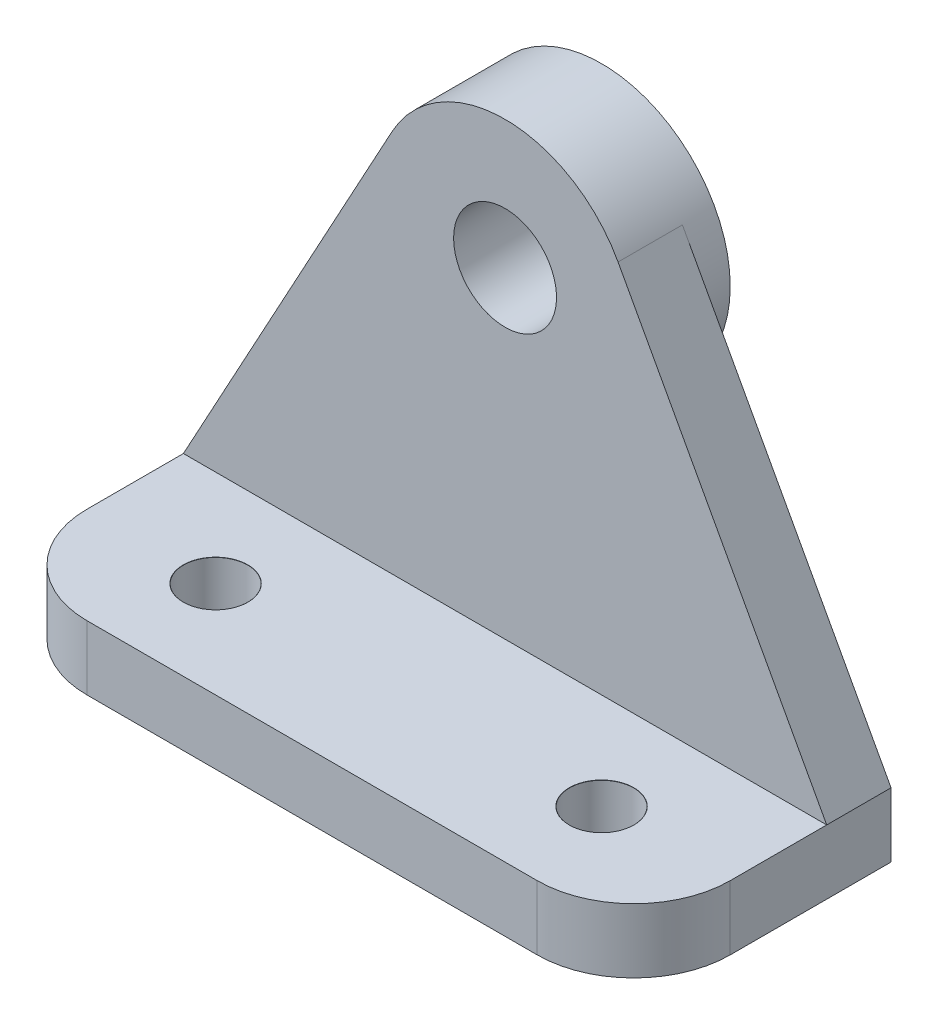
ISO-10303-21;
HEADER;
FILE_DESCRIPTION(('STEP AP214'),'2;1');
FILE_NAME('part.step','',(''),(''),'','','');
FILE_SCHEMA(('AUTOMOTIVE_DESIGN { 1 0 10303 214 1 1 1 1 }'));
ENDSEC;
DATA;
#1=APPLICATION_CONTEXT('core data for automotive mechanical design processes');
#2=APPLICATION_PROTOCOL_DEFINITION('international standard','automotive_design',2000,#1);
#3=PRODUCT_CONTEXT('',#1,'mechanical');
#4=PRODUCT('Part','Part','',(#3));
#5=PRODUCT_RELATED_PRODUCT_CATEGORY('part','',(#4));
#6=PRODUCT_DEFINITION_FORMATION('','',#4);
#7=PRODUCT_DEFINITION_CONTEXT('part definition',#1,'design');
#8=PRODUCT_DEFINITION('design','',#6,#7);
#9=PRODUCT_DEFINITION_SHAPE('','',#8);
#10=(LENGTH_UNIT() NAMED_UNIT(*) SI_UNIT(.MILLI.,.METRE.));
#11=(NAMED_UNIT(*) PLANE_ANGLE_UNIT() SI_UNIT($,.RADIAN.));
#12=(NAMED_UNIT(*) SI_UNIT($,.STERADIAN.) SOLID_ANGLE_UNIT());
#13=UNCERTAINTY_MEASURE_WITH_UNIT(LENGTH_MEASURE(1.E-05),#10,'distance_accuracy_value','');
#14=(GEOMETRIC_REPRESENTATION_CONTEXT(3) GLOBAL_UNCERTAINTY_ASSIGNED_CONTEXT((#13)) GLOBAL_UNIT_ASSIGNED_CONTEXT((#10,
#11,#12)) REPRESENTATION_CONTEXT('',''));
#15=CARTESIAN_POINT('',(0.,0.,0.));
#16=DIRECTION('',(0.,0.,1.));
#17=DIRECTION('',(1.,0.,0.));
#18=AXIS2_PLACEMENT_3D('',#15,#16,#17);
#19=CARTESIAN_POINT('',(-50.,10.,0.));
#20=DIRECTION('',(1.,0.,0.));
#21=DIRECTION('',(0.,0.,-1.));
#22=AXIS2_PLACEMENT_3D('',#19,#20,#21);
#23=PLANE('',#22);
#24=DIRECTION('',(0.,0.,1.));
#25=VECTOR('',#24,1.);
#26=CARTESIAN_POINT('',(-50.,0.,0.));
#27=LINE('',#26,#25);
#28=CARTESIAN_POINT('',(-50.,0.,-40.));
#29=VERTEX_POINT('',#28);
#30=CARTESIAN_POINT('',(-50.,0.,-15.));
#31=VERTEX_POINT('',#30);
#32=EDGE_CURVE('E133',#29,#31,#27,.T.);
#33=ORIENTED_EDGE('',*,*,#32,.T.);
#34=DIRECTION('',(0.,-1.,0.));
#35=VECTOR('',#34,1.);
#36=CARTESIAN_POINT('',(-50.,10.,-15.));
#37=LINE('',#36,#35);
#38=CARTESIAN_POINT('',(-50.,10.,-15.));
#39=VERTEX_POINT('',#38);
#40=EDGE_CURVE('E11',#31,#39,#37,.F.);
#41=ORIENTED_EDGE('',*,*,#40,.T.);
#42=DIRECTION('',(0.,0.,1.));
#43=VECTOR('',#42,1.);
#44=CARTESIAN_POINT('',(-50.,10.,0.));
#45=LINE('',#44,#43);
#46=CARTESIAN_POINT('',(-50.,10.,-30.));
#47=VERTEX_POINT('',#46);
#48=EDGE_CURVE('E153',#47,#39,#45,.T.);
#49=ORIENTED_EDGE('',*,*,#48,.F.);
#50=CARTESIAN_POINT('',(-50.,10.,-40.));
#51=VERTEX_POINT('',#50);
#52=EDGE_CURVE('E150',#51,#47,#45,.T.);
#53=ORIENTED_EDGE('',*,*,#52,.F.);
#54=DIRECTION('',(0.,-1.,0.));
#55=VECTOR('',#54,1.);
#56=CARTESIAN_POINT('',(-50.,10.,-40.));
#57=LINE('',#56,#55);
#58=EDGE_CURVE('E138',#51,#29,#57,.T.);
#59=ORIENTED_EDGE('',*,*,#58,.T.);
#60=EDGE_LOOP('',(#33,#41,#49,#53,#59));
#61=FACE_BOUND('',#60,.T.);
#62=ADVANCED_FACE('F39',(#61),#23,.F.);
#63=CARTESIAN_POINT('',(50.,10.,0.));
#64=DIRECTION('',(0.,0.,-1.));
#65=DIRECTION('',(-1.,0.,0.));
#66=AXIS2_PLACEMENT_3D('',#63,#64,#65);
#67=PLANE('',#66);
#68=DIRECTION('',(1.,0.,0.));
#69=VECTOR('',#68,1.);
#70=CARTESIAN_POINT('',(50.,0.,0.));
#71=LINE('',#70,#69);
#72=CARTESIAN_POINT('',(-35.,0.,0.));
#73=VERTEX_POINT('',#72);
#74=CARTESIAN_POINT('',(35.,0.,0.));
#75=VERTEX_POINT('',#74);
#76=EDGE_CURVE('E158',#73,#75,#71,.T.);
#77=ORIENTED_EDGE('',*,*,#76,.T.);
#78=DIRECTION('',(0.,-1.,0.));
#79=VECTOR('',#78,1.);
#80=CARTESIAN_POINT('',(35.,10.,0.));
#81=LINE('',#80,#79);
#82=CARTESIAN_POINT('',(35.,10.,0.));
#83=VERTEX_POINT('',#82);
#84=EDGE_CURVE('E60',#75,#83,#81,.F.);
#85=ORIENTED_EDGE('',*,*,#84,.T.);
#86=DIRECTION('',(1.,0.,0.));
#87=VECTOR('',#86,1.);
#88=CARTESIAN_POINT('',(50.,10.,0.));
#89=LINE('',#88,#87);
#90=CARTESIAN_POINT('',(-35.,10.,0.));
#91=VERTEX_POINT('',#90);
#92=EDGE_CURVE('E152',#91,#83,#89,.T.);
#93=ORIENTED_EDGE('',*,*,#92,.F.);
#94=DIRECTION('',(0.,-1.,0.));
#95=VECTOR('',#94,1.);
#96=CARTESIAN_POINT('',(-35.,10.,0.));
#97=LINE('',#96,#95);
#98=EDGE_CURVE('E175',#91,#73,#97,.T.);
#99=ORIENTED_EDGE('',*,*,#98,.T.);
#100=EDGE_LOOP('',(#77,#85,#93,#99));
#101=FACE_BOUND('',#100,.T.);
#102=ADVANCED_FACE('F198',(#101),#67,.F.);
#103=CARTESIAN_POINT('',(50.,10.,-40.));
#104=DIRECTION('',(-1.,0.,0.));
#105=DIRECTION('',(0.,0.,1.));
#106=AXIS2_PLACEMENT_3D('',#103,#104,#105);
#107=PLANE('',#106);
#108=DIRECTION('',(0.,0.,-1.));
#109=VECTOR('',#108,1.);
#110=CARTESIAN_POINT('',(50.,10.,-40.));
#111=LINE('',#110,#109);
#112=CARTESIAN_POINT('',(50.,10.,-15.));
#113=VERTEX_POINT('',#112);
#114=CARTESIAN_POINT('',(50.,10.,-30.));
#115=VERTEX_POINT('',#114);
#116=EDGE_CURVE('E155',#113,#115,#111,.T.);
#117=ORIENTED_EDGE('',*,*,#116,.F.);
#118=DIRECTION('',(0.,-1.,0.));
#119=VECTOR('',#118,1.);
#120=CARTESIAN_POINT('',(50.,10.,-15.));
#121=LINE('',#120,#119);
#122=CARTESIAN_POINT('',(50.,0.,-15.));
#123=VERTEX_POINT('',#122);
#124=EDGE_CURVE('E168',#113,#123,#121,.T.);
#125=ORIENTED_EDGE('',*,*,#124,.T.);
#126=DIRECTION('',(0.,0.,-1.));
#127=VECTOR('',#126,1.);
#128=CARTESIAN_POINT('',(50.,0.,-40.));
#129=LINE('',#128,#127);
#130=CARTESIAN_POINT('',(50.,0.,-40.));
#131=VERTEX_POINT('',#130);
#132=EDGE_CURVE('E160',#123,#131,#129,.T.);
#133=ORIENTED_EDGE('',*,*,#132,.T.);
#134=DIRECTION('',(0.,-1.,0.));
#135=VECTOR('',#134,1.);
#136=CARTESIAN_POINT('',(50.,10.,-40.));
#137=LINE('',#136,#135);
#138=CARTESIAN_POINT('',(50.,10.,-40.));
#139=VERTEX_POINT('',#138);
#140=EDGE_CURVE('E165',#139,#131,#137,.T.);
#141=ORIENTED_EDGE('',*,*,#140,.F.);
#142=DIRECTION('',(0.,0.,-1.));
#143=VECTOR('',#142,1.);
#144=CARTESIAN_POINT('',(50.,10.,-30.));
#145=LINE('',#144,#143);
#146=EDGE_CURVE('E134',#115,#139,#145,.T.);
#147=ORIENTED_EDGE('',*,*,#146,.F.);
#148=EDGE_LOOP('',(#117,#125,#133,#141,#147));
#149=FACE_BOUND('',#148,.T.);
#150=ADVANCED_FACE('F190',(#149),#107,.F.);
#151=CARTESIAN_POINT('',(-50.,10.,-40.));
#152=DIRECTION('',(0.,0.,1.));
#153=DIRECTION('',(1.,0.,0.));
#154=AXIS2_PLACEMENT_3D('',#151,#152,#153);
#155=PLANE('',#154);
#156=DIRECTION('',(0.478232998312527,0.878232998312527,0.));
#157=VECTOR('',#156,1.);
#158=CARTESIAN_POINT('',(-17.5646599662505,69.5646599662505,-40.));
#159=LINE('',#158,#157);
#160=CARTESIAN_POINT('',(-17.5646599662505,69.5646599662505,-40.));
#161=VERTEX_POINT('',#160);
#162=EDGE_CURVE('E130',#51,#161,#159,.T.);
#163=ORIENTED_EDGE('',*,*,#162,.T.);
#164=CARTESIAN_POINT('',(0.,60.,-40.));
#165=DIRECTION('',(0.,0.,1.));
#166=DIRECTION('',(1.,0.,0.));
#167=AXIS2_PLACEMENT_3D('',#164,#165,#166);
#168=CIRCLE('',#167,20.);
#169=CARTESIAN_POINT('',(17.5646599662505,69.5646599662505,-40.));
#170=VERTEX_POINT('',#169);
#171=EDGE_CURVE('E111',#161,#170,#168,.T.);
#172=ORIENTED_EDGE('',*,*,#171,.T.);
#173=DIRECTION('',(0.478232998312527,-0.878232998312527,0.));
#174=VECTOR('',#173,1.);
#175=CARTESIAN_POINT('',(17.5646599662505,69.5646599662505,-40.));
#176=LINE('',#175,#174);
#177=EDGE_CURVE('E141',#170,#139,#176,.T.);
#178=ORIENTED_EDGE('',*,*,#177,.T.);
#179=ORIENTED_EDGE('',*,*,#140,.T.);
#180=DIRECTION('',(-1.,0.,0.));
#181=VECTOR('',#180,1.);
#182=CARTESIAN_POINT('',(-50.,0.,-40.));
#183=LINE('',#182,#181);
#184=EDGE_CURVE('E162',#131,#29,#183,.T.);
#185=ORIENTED_EDGE('',*,*,#184,.T.);
#186=ORIENTED_EDGE('',*,*,#58,.F.);
#187=EDGE_LOOP('',(#163,#172,#178,#179,#185,#186));
#188=FACE_BOUND('',#187,.T.);
#189=ADVANCED_FACE('F136',(#188),#155,.F.);
#190=CARTESIAN_POINT('',(0.,10.,0.));
#191=DIRECTION('',(0.,-1.,0.));
#192=DIRECTION('',(0.,0.,-1.));
#193=AXIS2_PLACEMENT_3D('',#190,#191,#192);
#194=PLANE('',#193);
#195=CARTESIAN_POINT('',(-30.,10.,-15.));
#196=DIRECTION('',(0.,1.,0.));
#197=DIRECTION('',(0.,0.,1.));
#198=AXIS2_PLACEMENT_3D('',#195,#196,#197);
#199=CIRCLE('',#198,5.025);
#200=CARTESIAN_POINT('',(-30.,10.,-9.97499999999998));
#201=VERTEX_POINT('',#200);
#202=EDGE_CURVE('E232',#201,#201,#199,.T.);
#203=ORIENTED_EDGE('',*,*,#202,.F.);
#204=EDGE_LOOP('',(#203));
#205=FACE_BOUND('',#204,.T.);
#206=CARTESIAN_POINT('',(30.,10.,-15.));
#207=DIRECTION('',(0.,1.,0.));
#208=DIRECTION('',(0.,0.,1.));
#209=AXIS2_PLACEMENT_3D('',#206,#207,#208);
#210=CIRCLE('',#209,5.025);
#211=CARTESIAN_POINT('',(30.,10.,-9.975));
#212=VERTEX_POINT('',#211);
#213=EDGE_CURVE('E223',#212,#212,#210,.T.);
#214=ORIENTED_EDGE('',*,*,#213,.F.);
#215=EDGE_LOOP('',(#214));
#216=FACE_BOUND('',#215,.T.);
#217=ORIENTED_EDGE('',*,*,#92,.T.);
#218=CARTESIAN_POINT('',(35.,10.,-15.));
#219=DIRECTION('',(0.,-1.,0.));
#220=DIRECTION('',(0.,0.,-1.));
#221=AXIS2_PLACEMENT_3D('',#218,#219,#220);
#222=CIRCLE('',#221,15.);
#223=EDGE_CURVE('E47',#83,#113,#222,.F.);
#224=ORIENTED_EDGE('',*,*,#223,.T.);
#225=ORIENTED_EDGE('',*,*,#116,.T.);
#226=DIRECTION('',(-1.,0.,0.));
#227=VECTOR('',#226,1.);
#228=CARTESIAN_POINT('',(50.,10.,-30.));
#229=LINE('',#228,#227);
#230=EDGE_CURVE('E203',#115,#47,#229,.T.);
#231=ORIENTED_EDGE('',*,*,#230,.T.);
#232=ORIENTED_EDGE('',*,*,#48,.T.);
#233=CARTESIAN_POINT('',(-35.,10.,-15.));
#234=DIRECTION('',(0.,-1.,0.));
#235=DIRECTION('',(0.,0.,-1.));
#236=AXIS2_PLACEMENT_3D('',#233,#234,#235);
#237=CIRCLE('',#236,15.);
#238=EDGE_CURVE('E179',#39,#91,#237,.F.);
#239=ORIENTED_EDGE('',*,*,#238,.T.);
#240=EDGE_LOOP('',(#217,#224,#225,#231,#232,#239));
#241=FACE_BOUND('',#240,.T.);
#242=ADVANCED_FACE('F183',(#205,#216,#241),#194,.F.);
#243=CARTESIAN_POINT('',(0.,0.,0.));
#244=DIRECTION('',(0.,-1.,0.));
#245=DIRECTION('',(0.,0.,-1.));
#246=AXIS2_PLACEMENT_3D('',#243,#244,#245);
#247=PLANE('',#246);
#248=CARTESIAN_POINT('',(-30.,0.,-15.));
#249=DIRECTION('',(0.,1.,0.));
#250=DIRECTION('',(0.,0.,1.));
#251=AXIS2_PLACEMENT_3D('',#248,#249,#250);
#252=CIRCLE('',#251,5.);
#253=CARTESIAN_POINT('',(-30.,0.,-9.99999999999999));
#254=VERTEX_POINT('',#253);
#255=EDGE_CURVE('E226',#254,#254,#252,.T.);
#256=ORIENTED_EDGE('',*,*,#255,.T.);
#257=EDGE_LOOP('',(#256));
#258=FACE_BOUND('',#257,.T.);
#259=CARTESIAN_POINT('',(30.,0.,-15.));
#260=DIRECTION('',(0.,1.,0.));
#261=DIRECTION('',(0.,0.,1.));
#262=AXIS2_PLACEMENT_3D('',#259,#260,#261);
#263=CIRCLE('',#262,5.);
#264=CARTESIAN_POINT('',(30.,0.,-10.));
#265=VERTEX_POINT('',#264);
#266=EDGE_CURVE('E217',#265,#265,#263,.T.);
#267=ORIENTED_EDGE('',*,*,#266,.T.);
#268=EDGE_LOOP('',(#267));
#269=FACE_BOUND('',#268,.T.);
#270=ORIENTED_EDGE('',*,*,#132,.F.);
#271=CARTESIAN_POINT('',(35.,0.,-15.));
#272=DIRECTION('',(0.,-1.,0.));
#273=DIRECTION('',(0.,0.,-1.));
#274=AXIS2_PLACEMENT_3D('',#271,#272,#273);
#275=CIRCLE('',#274,15.);
#276=EDGE_CURVE('E173',#123,#75,#275,.T.);
#277=ORIENTED_EDGE('',*,*,#276,.T.);
#278=ORIENTED_EDGE('',*,*,#76,.F.);
#279=CARTESIAN_POINT('',(-35.,0.,-15.));
#280=DIRECTION('',(0.,-1.,0.));
#281=DIRECTION('',(0.,0.,-1.));
#282=AXIS2_PLACEMENT_3D('',#279,#280,#281);
#283=CIRCLE('',#282,15.);
#284=EDGE_CURVE('E171',#73,#31,#283,.T.);
#285=ORIENTED_EDGE('',*,*,#284,.T.);
#286=ORIENTED_EDGE('',*,*,#32,.F.);
#287=ORIENTED_EDGE('',*,*,#184,.F.);
#288=EDGE_LOOP('',(#270,#277,#278,#285,#286,#287));
#289=FACE_BOUND('',#288,.T.);
#290=ADVANCED_FACE('F196',(#258,#269,#289),#247,.T.);
#291=CARTESIAN_POINT('',(0.,60.,-30.));
#292=DIRECTION('',(0.,0.,-1.));
#293=DIRECTION('',(-1.,0.,0.));
#294=AXIS2_PLACEMENT_3D('',#291,#292,#293);
#295=CYLINDRICAL_SURFACE('',#294,20.);
#296=DIRECTION('',(0.,0.,-1.));
#297=VECTOR('',#296,1.);
#298=CARTESIAN_POINT('',(17.5646599662505,69.5646599662505,-30.));
#299=LINE('',#298,#297);
#300=CARTESIAN_POINT('',(17.5646599662505,69.5646599662505,-30.));
#301=VERTEX_POINT('',#300);
#302=EDGE_CURVE('E118',#301,#170,#299,.T.);
#303=ORIENTED_EDGE('',*,*,#302,.T.);
#304=ORIENTED_EDGE('',*,*,#171,.F.);
#305=DIRECTION('',(0.,0.,-1.));
#306=VECTOR('',#305,1.);
#307=CARTESIAN_POINT('',(-17.5646599662505,69.5646599662505,-30.));
#308=LINE('',#307,#306);
#309=CARTESIAN_POINT('',(-17.5646599662505,69.5646599662505,-30.));
#310=VERTEX_POINT('',#309);
#311=EDGE_CURVE('E116',#310,#161,#308,.T.);
#312=ORIENTED_EDGE('',*,*,#311,.F.);
#313=CARTESIAN_POINT('',(0.,60.,-30.));
#314=DIRECTION('',(0.,0.,-1.));
#315=DIRECTION('',(1.,0.,0.));
#316=AXIS2_PLACEMENT_3D('',#313,#314,#315);
#317=CIRCLE('',#316,20.);
#318=EDGE_CURVE('E140',#310,#301,#317,.T.);
#319=ORIENTED_EDGE('',*,*,#318,.T.);
#320=EDGE_LOOP('',(#303,#304,#312,#319));
#321=FACE_BOUND('',#320,.T.);
#322=CARTESIAN_POINT('',(0.,60.,-45.));
#323=DIRECTION('',(0.,0.,1.));
#324=DIRECTION('',(1.,0.,0.));
#325=AXIS2_PLACEMENT_3D('',#322,#323,#324);
#326=CIRCLE('',#325,20.);
#327=CARTESIAN_POINT('',(20.,60.,-45.));
#328=VERTEX_POINT('',#327);
#329=EDGE_CURVE('E124',#328,#328,#326,.T.);
#330=ORIENTED_EDGE('',*,*,#329,.T.);
#331=EDGE_LOOP('',(#330));
#332=FACE_BOUND('',#331,.T.);
#333=ADVANCED_FACE('F113',(#321,#332),#295,.T.);
#334=CARTESIAN_POINT('',(-17.5646599662505,69.5646599662505,-30.));
#335=DIRECTION('',(-0.878232998312527,0.478232998312527,0.));
#336=DIRECTION('',(-0.478232998312527,-0.878232998312527,0.));
#337=AXIS2_PLACEMENT_3D('',#334,#335,#336);
#338=PLANE('',#337);
#339=ORIENTED_EDGE('',*,*,#162,.F.);
#340=ORIENTED_EDGE('',*,*,#52,.T.);
#341=DIRECTION('',(0.478232998312527,0.878232998312527,0.));
#342=VECTOR('',#341,1.);
#343=CARTESIAN_POINT('',(-17.5646599662505,69.5646599662505,-30.));
#344=LINE('',#343,#342);
#345=EDGE_CURVE('E132',#47,#310,#344,.T.);
#346=ORIENTED_EDGE('',*,*,#345,.T.);
#347=ORIENTED_EDGE('',*,*,#311,.T.);
#348=EDGE_LOOP('',(#339,#340,#346,#347));
#349=FACE_BOUND('',#348,.T.);
#350=ADVANCED_FACE('F128',(#349),#338,.T.);
#351=CARTESIAN_POINT('',(17.5646599662505,69.5646599662505,-30.));
#352=DIRECTION('',(0.878232998312527,0.478232998312527,0.));
#353=DIRECTION('',(-0.478232998312527,0.878232998312527,0.));
#354=AXIS2_PLACEMENT_3D('',#351,#352,#353);
#355=PLANE('',#354);
#356=ORIENTED_EDGE('',*,*,#177,.F.);
#357=ORIENTED_EDGE('',*,*,#302,.F.);
#358=DIRECTION('',(0.478232998312527,-0.878232998312527,0.));
#359=VECTOR('',#358,1.);
#360=CARTESIAN_POINT('',(17.5646599662505,69.5646599662505,-30.));
#361=LINE('',#360,#359);
#362=EDGE_CURVE('E143',#301,#115,#361,.T.);
#363=ORIENTED_EDGE('',*,*,#362,.T.);
#364=ORIENTED_EDGE('',*,*,#146,.T.);
#365=EDGE_LOOP('',(#356,#357,#363,#364));
#366=FACE_BOUND('',#365,.T.);
#367=ADVANCED_FACE('F338',(#366),#355,.T.);
#368=CARTESIAN_POINT('',(0.,60.,-30.));
#369=DIRECTION('',(0.,0.,1.));
#370=DIRECTION('',(1.,0.,0.));
#371=AXIS2_PLACEMENT_3D('',#368,#369,#370);
#372=PLANE('',#371);
#373=ORIENTED_EDGE('',*,*,#362,.F.);
#374=ORIENTED_EDGE('',*,*,#318,.F.);
#375=ORIENTED_EDGE('',*,*,#345,.F.);
#376=ORIENTED_EDGE('',*,*,#230,.F.);
#377=EDGE_LOOP('',(#373,#374,#375,#376));
#378=FACE_BOUND('',#377,.T.);
#379=CARTESIAN_POINT('',(0.,60.,-30.));
#380=DIRECTION('',(0.,0.,-1.));
#381=DIRECTION('',(-1.,0.,0.));
#382=AXIS2_PLACEMENT_3D('',#379,#380,#381);
#383=CIRCLE('',#382,8.);
#384=CARTESIAN_POINT('',(-8.00000000000001,60.,-30.));
#385=VERTEX_POINT('',#384);
#386=EDGE_CURVE('E123',#385,#385,#383,.T.);
#387=ORIENTED_EDGE('',*,*,#386,.T.);
#388=EDGE_LOOP('',(#387));
#389=FACE_BOUND('',#388,.T.);
#390=ADVANCED_FACE('F314',(#378,#389),#372,.T.);
#391=CARTESIAN_POINT('',(0.,60.,-30.));
#392=DIRECTION('',(0.,0.,-1.));
#393=DIRECTION('',(-1.,0.,0.));
#394=AXIS2_PLACEMENT_3D('',#391,#392,#393);
#395=CYLINDRICAL_SURFACE('',#394,8.);
#396=ORIENTED_EDGE('',*,*,#386,.F.);
#397=EDGE_LOOP('',(#396));
#398=FACE_BOUND('',#397,.T.);
#399=CARTESIAN_POINT('',(0.,60.,-45.));
#400=DIRECTION('',(0.,0.,1.));
#401=DIRECTION('',(1.,0.,0.));
#402=AXIS2_PLACEMENT_3D('',#399,#400,#401);
#403=CIRCLE('',#402,8.);
#404=CARTESIAN_POINT('',(7.99999999999999,60.,-45.));
#405=VERTEX_POINT('',#404);
#406=EDGE_CURVE('E214',#405,#405,#403,.T.);
#407=ORIENTED_EDGE('',*,*,#406,.F.);
#408=EDGE_LOOP('',(#407));
#409=FACE_BOUND('',#408,.T.);
#410=ADVANCED_FACE('F303',(#398,#409),#395,.F.);
#411=CARTESIAN_POINT('',(0.,60.,-45.));
#412=DIRECTION('',(0.,0.,1.));
#413=DIRECTION('',(1.,0.,0.));
#414=AXIS2_PLACEMENT_3D('',#411,#412,#413);
#415=PLANE('',#414);
#416=ORIENTED_EDGE('',*,*,#406,.T.);
#417=EDGE_LOOP('',(#416));
#418=FACE_BOUND('',#417,.T.);
#419=ORIENTED_EDGE('',*,*,#329,.F.);
#420=EDGE_LOOP('',(#419));
#421=FACE_BOUND('',#420,.T.);
#422=ADVANCED_FACE('F255',(#418,#421),#415,.F.);
#423=CARTESIAN_POINT('',(30.,10.,-15.));
#424=DIRECTION('',(0.,1.,0.));
#425=DIRECTION('',(0.,0.,1.));
#426=AXIS2_PLACEMENT_3D('',#423,#424,#425);
#427=CYLINDRICAL_SURFACE('',#426,5.);
#428=ORIENTED_EDGE('',*,*,#266,.F.);
#429=EDGE_LOOP('',(#428));
#430=FACE_BOUND('',#429,.T.);
#431=CARTESIAN_POINT('',(30.,9.97902250922057,-15.));
#432=DIRECTION('',(0.,1.,0.));
#433=DIRECTION('',(0.,0.,1.));
#434=AXIS2_PLACEMENT_3D('',#431,#432,#433);
#435=CIRCLE('',#434,5.);
#436=CARTESIAN_POINT('',(30.,9.97902250922057,-10.));
#437=VERTEX_POINT('',#436);
#438=EDGE_CURVE('E220',#437,#437,#435,.T.);
#439=ORIENTED_EDGE('',*,*,#438,.T.);
#440=EDGE_LOOP('',(#439));
#441=FACE_BOUND('',#440,.T.);
#442=ADVANCED_FACE('F246',(#430,#441),#427,.F.);
#443=CARTESIAN_POINT('',(30.,10.,-15.));
#444=DIRECTION('',(0.,1.,0.));
#445=DIRECTION('',(0.,0.,1.));
#446=AXIS2_PLACEMENT_3D('',#443,#444,#445);
#447=CONICAL_SURFACE('',#446,5.025,0.872664625997186);
#448=ORIENTED_EDGE('',*,*,#438,.F.);
#449=EDGE_LOOP('',(#448));
#450=FACE_BOUND('',#449,.T.);
#451=ORIENTED_EDGE('',*,*,#213,.T.);
#452=EDGE_LOOP('',(#451));
#453=FACE_BOUND('',#452,.T.);
#454=ADVANCED_FACE('F243',(#450,#453),#447,.F.);
#455=CARTESIAN_POINT('',(-30.,10.,-15.));
#456=DIRECTION('',(0.,1.,0.));
#457=DIRECTION('',(0.,0.,1.));
#458=AXIS2_PLACEMENT_3D('',#455,#456,#457);
#459=CYLINDRICAL_SURFACE('',#458,4.99999999999999);
#460=ORIENTED_EDGE('',*,*,#255,.F.);
#461=EDGE_LOOP('',(#460));
#462=FACE_BOUND('',#461,.T.);
#463=CARTESIAN_POINT('',(-30.,9.97902250922056,-15.));
#464=DIRECTION('',(0.,1.,0.));
#465=DIRECTION('',(0.,0.,1.));
#466=AXIS2_PLACEMENT_3D('',#463,#464,#465);
#467=CIRCLE('',#466,4.99999999999999);
#468=CARTESIAN_POINT('',(-30.,9.97902250922056,-10.));
#469=VERTEX_POINT('',#468);
#470=EDGE_CURVE('E229',#469,#469,#467,.T.);
#471=ORIENTED_EDGE('',*,*,#470,.T.);
#472=EDGE_LOOP('',(#471));
#473=FACE_BOUND('',#472,.T.);
#474=ADVANCED_FACE('F245',(#462,#473),#459,.F.);
#475=CARTESIAN_POINT('',(-30.,10.,-15.));
#476=DIRECTION('',(0.,1.,0.));
#477=DIRECTION('',(0.,0.,1.));
#478=AXIS2_PLACEMENT_3D('',#475,#476,#477);
#479=CONICAL_SURFACE('',#478,5.025,0.87266462599731);
#480=ORIENTED_EDGE('',*,*,#470,.F.);
#481=EDGE_LOOP('',(#480));
#482=FACE_BOUND('',#481,.T.);
#483=ORIENTED_EDGE('',*,*,#202,.T.);
#484=EDGE_LOOP('',(#483));
#485=FACE_BOUND('',#484,.T.);
#486=ADVANCED_FACE('F236',(#482,#485),#479,.F.);
#487=CARTESIAN_POINT('',(35.,10.,-15.));
#488=DIRECTION('',(0.,-1.,0.));
#489=DIRECTION('',(0.,0.,-1.));
#490=AXIS2_PLACEMENT_3D('',#487,#488,#489);
#491=CYLINDRICAL_SURFACE('',#490,15.);
#492=ORIENTED_EDGE('',*,*,#223,.F.);
#493=ORIENTED_EDGE('',*,*,#84,.F.);
#494=ORIENTED_EDGE('',*,*,#276,.F.);
#495=ORIENTED_EDGE('',*,*,#124,.F.);
#496=EDGE_LOOP('',(#492,#493,#494,#495));
#497=FACE_BOUND('',#496,.T.);
#498=ADVANCED_FACE('F193',(#497),#491,.T.);
#499=CARTESIAN_POINT('',(-35.,10.,-15.));
#500=DIRECTION('',(0.,-1.,0.));
#501=DIRECTION('',(0.,0.,-1.));
#502=AXIS2_PLACEMENT_3D('',#499,#500,#501);
#503=CYLINDRICAL_SURFACE('',#502,15.);
#504=ORIENTED_EDGE('',*,*,#238,.F.);
#505=ORIENTED_EDGE('',*,*,#40,.F.);
#506=ORIENTED_EDGE('',*,*,#284,.F.);
#507=ORIENTED_EDGE('',*,*,#98,.F.);
#508=EDGE_LOOP('',(#504,#505,#506,#507));
#509=FACE_BOUND('',#508,.T.);
#510=ADVANCED_FACE('F41',(#509),#503,.T.);
#511=CLOSED_SHELL('',(#62,#102,#150,#189,#242,#290,#333,#350,#367,#390,#410,#422,#442,#454,#474,
#486,#498,#510));
#512=MANIFOLD_SOLID_BREP('B2',#511);
#513=ADVANCED_BREP_SHAPE_REPRESENTATION('',(#18,#512),#14);
#514=SHAPE_DEFINITION_REPRESENTATION(#9,#513);
ENDSEC;
END-ISO-10303-21;
